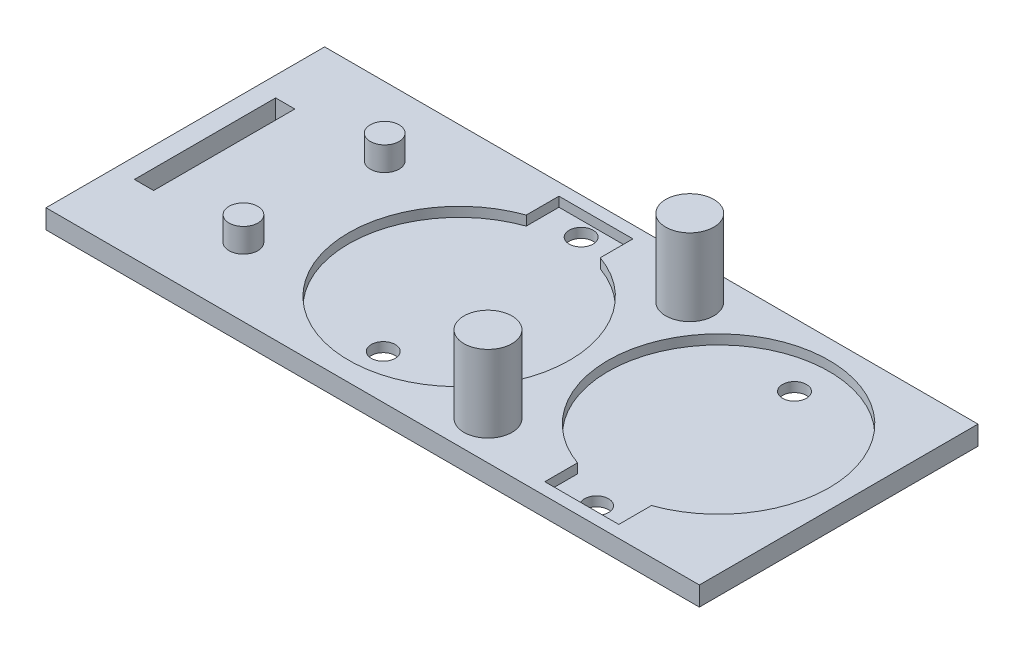
ISO-10303-21;
HEADER;
FILE_DESCRIPTION(('STEP AP214'),'2;1');
FILE_NAME('part.step','',(''),(''),'','','');
FILE_SCHEMA(('AUTOMOTIVE_DESIGN { 1 0 10303 214 1 1 1 1 }'));
ENDSEC;
DATA;
#1=APPLICATION_CONTEXT('core data for automotive mechanical design processes');
#2=APPLICATION_PROTOCOL_DEFINITION('international standard','automotive_design',2000,#1);
#3=PRODUCT_CONTEXT('',#1,'mechanical');
#4=PRODUCT('Part','Part','',(#3));
#5=PRODUCT_RELATED_PRODUCT_CATEGORY('part','',(#4));
#6=PRODUCT_DEFINITION_FORMATION('','',#4);
#7=PRODUCT_DEFINITION_CONTEXT('part definition',#1,'design');
#8=PRODUCT_DEFINITION('design','',#6,#7);
#9=PRODUCT_DEFINITION_SHAPE('','',#8);
#10=(LENGTH_UNIT() NAMED_UNIT(*) SI_UNIT(.MILLI.,.METRE.));
#11=(NAMED_UNIT(*) PLANE_ANGLE_UNIT() SI_UNIT($,.RADIAN.));
#12=(NAMED_UNIT(*) SI_UNIT($,.STERADIAN.) SOLID_ANGLE_UNIT());
#13=UNCERTAINTY_MEASURE_WITH_UNIT(LENGTH_MEASURE(1.E-05),#10,'distance_accuracy_value','');
#14=(GEOMETRIC_REPRESENTATION_CONTEXT(3) GLOBAL_UNCERTAINTY_ASSIGNED_CONTEXT((#13)) GLOBAL_UNIT_ASSIGNED_CONTEXT((#10,
#11,#12)) REPRESENTATION_CONTEXT('',''));
#15=CARTESIAN_POINT('',(0.,0.,0.));
#16=DIRECTION('',(0.,0.,1.));
#17=DIRECTION('',(1.,0.,0.));
#18=AXIS2_PLACEMENT_3D('',#15,#16,#17);
#19=CARTESIAN_POINT('',(-27.5555555555556,2.,-17.0555555555556));
#20=DIRECTION('',(1.,0.,0.));
#21=DIRECTION('',(0.,0.,-1.));
#22=AXIS2_PLACEMENT_3D('',#19,#20,#21);
#23=PLANE('',#22);
#24=DIRECTION('',(0.,0.,1.));
#25=VECTOR('',#24,1.);
#26=CARTESIAN_POINT('',(-27.5555555555556,0.,-17.0555555555556));
#27=LINE('',#26,#25);
#28=CARTESIAN_POINT('',(-27.5555555555556,0.,-17.0555555555556));
#29=VERTEX_POINT('',#28);
#30=CARTESIAN_POINT('',(-27.5555555555555,0.,11.9444444444444));
#31=VERTEX_POINT('',#30);
#32=EDGE_CURVE('E244',#29,#31,#27,.T.);
#33=ORIENTED_EDGE('',*,*,#32,.T.);
#34=DIRECTION('',(0.,-1.,0.));
#35=VECTOR('',#34,1.);
#36=CARTESIAN_POINT('',(-27.5555555555555,2.,11.9444444444444));
#37=LINE('',#36,#35);
#38=CARTESIAN_POINT('',(-27.5555555555555,2.,11.9444444444444));
#39=VERTEX_POINT('',#38);
#40=EDGE_CURVE('E273',#39,#31,#37,.T.);
#41=ORIENTED_EDGE('',*,*,#40,.F.);
#42=DIRECTION('',(0.,0.,1.));
#43=VECTOR('',#42,1.);
#44=CARTESIAN_POINT('',(-27.5555555555556,2.,-17.0555555555556));
#45=LINE('',#44,#43);
#46=CARTESIAN_POINT('',(-27.5555555555556,2.,-17.0555555555556));
#47=VERTEX_POINT('',#46);
#48=EDGE_CURVE('E247',#47,#39,#45,.T.);
#49=ORIENTED_EDGE('',*,*,#48,.F.);
#50=DIRECTION('',(0.,-1.,0.));
#51=VECTOR('',#50,1.);
#52=CARTESIAN_POINT('',(-27.5555555555556,2.,-17.0555555555556));
#53=LINE('',#52,#51);
#54=EDGE_CURVE('E257',#47,#29,#53,.T.);
#55=ORIENTED_EDGE('',*,*,#54,.T.);
#56=EDGE_LOOP('',(#33,#41,#49,#55));
#57=FACE_BOUND('',#56,.T.);
#58=ADVANCED_FACE('F33',(#57),#23,.F.);
#59=CARTESIAN_POINT('',(-27.5555555555555,2.,11.9444444444444));
#60=DIRECTION('',(0.,0.,-1.));
#61=DIRECTION('',(-1.,0.,0.));
#62=AXIS2_PLACEMENT_3D('',#59,#60,#61);
#63=PLANE('',#62);
#64=DIRECTION('',(1.,0.,0.));
#65=VECTOR('',#64,1.);
#66=CARTESIAN_POINT('',(-27.5555555555555,0.,11.9444444444444));
#67=LINE('',#66,#65);
#68=CARTESIAN_POINT('',(40.4444444444444,0.,11.9444444444444));
#69=VERTEX_POINT('',#68);
#70=EDGE_CURVE('E260',#31,#69,#67,.T.);
#71=ORIENTED_EDGE('',*,*,#70,.T.);
#72=DIRECTION('',(0.,-1.,0.));
#73=VECTOR('',#72,1.);
#74=CARTESIAN_POINT('',(40.4444444444444,2.,11.9444444444444));
#75=LINE('',#74,#73);
#76=CARTESIAN_POINT('',(40.4444444444444,2.,11.9444444444444));
#77=VERTEX_POINT('',#76);
#78=EDGE_CURVE('E270',#77,#69,#75,.T.);
#79=ORIENTED_EDGE('',*,*,#78,.F.);
#80=DIRECTION('',(1.,0.,0.));
#81=VECTOR('',#80,1.);
#82=CARTESIAN_POINT('',(-27.5555555555555,2.,11.9444444444444));
#83=LINE('',#82,#81);
#84=EDGE_CURVE('E250',#39,#77,#83,.T.);
#85=ORIENTED_EDGE('',*,*,#84,.F.);
#86=ORIENTED_EDGE('',*,*,#40,.T.);
#87=EDGE_LOOP('',(#71,#79,#85,#86));
#88=FACE_BOUND('',#87,.T.);
#89=ADVANCED_FACE('F316',(#88),#63,.F.);
#90=CARTESIAN_POINT('',(40.4444444444445,2.,-17.0555555555556));
#91=DIRECTION('',(-1.,0.,0.));
#92=DIRECTION('',(0.,0.,1.));
#93=AXIS2_PLACEMENT_3D('',#90,#91,#92);
#94=PLANE('',#93);
#95=DIRECTION('',(0.,0.,-1.));
#96=VECTOR('',#95,1.);
#97=CARTESIAN_POINT('',(40.4444444444445,0.,-17.0555555555556));
#98=LINE('',#97,#96);
#99=CARTESIAN_POINT('',(40.4444444444445,0.,-17.0555555555556));
#100=VERTEX_POINT('',#99);
#101=EDGE_CURVE('E262',#69,#100,#98,.T.);
#102=ORIENTED_EDGE('',*,*,#101,.T.);
#103=DIRECTION('',(0.,-1.,0.));
#104=VECTOR('',#103,1.);
#105=CARTESIAN_POINT('',(40.4444444444445,2.,-17.0555555555556));
#106=LINE('',#105,#104);
#107=CARTESIAN_POINT('',(40.4444444444445,2.,-17.0555555555556));
#108=VERTEX_POINT('',#107);
#109=EDGE_CURVE('E267',#108,#100,#106,.T.);
#110=ORIENTED_EDGE('',*,*,#109,.F.);
#111=DIRECTION('',(0.,0.,-1.));
#112=VECTOR('',#111,1.);
#113=CARTESIAN_POINT('',(40.4444444444445,2.,-17.0555555555556));
#114=LINE('',#113,#112);
#115=EDGE_CURVE('E253',#77,#108,#114,.T.);
#116=ORIENTED_EDGE('',*,*,#115,.F.);
#117=ORIENTED_EDGE('',*,*,#78,.T.);
#118=EDGE_LOOP('',(#102,#110,#116,#117));
#119=FACE_BOUND('',#118,.T.);
#120=ADVANCED_FACE('F321',(#119),#94,.F.);
#121=CARTESIAN_POINT('',(-27.5555555555556,2.,-17.0555555555556));
#122=DIRECTION('',(0.,0.,1.));
#123=DIRECTION('',(1.,0.,0.));
#124=AXIS2_PLACEMENT_3D('',#121,#122,#123);
#125=PLANE('',#124);
#126=DIRECTION('',(-1.,0.,0.));
#127=VECTOR('',#126,1.);
#128=CARTESIAN_POINT('',(-27.5555555555556,0.,-17.0555555555556));
#129=LINE('',#128,#127);
#130=EDGE_CURVE('E251',#100,#29,#129,.T.);
#131=ORIENTED_EDGE('',*,*,#130,.T.);
#132=ORIENTED_EDGE('',*,*,#54,.F.);
#133=DIRECTION('',(-1.,0.,0.));
#134=VECTOR('',#133,1.);
#135=CARTESIAN_POINT('',(-27.5555555555556,2.,-17.0555555555556));
#136=LINE('',#135,#134);
#137=EDGE_CURVE('E255',#108,#47,#136,.T.);
#138=ORIENTED_EDGE('',*,*,#137,.F.);
#139=ORIENTED_EDGE('',*,*,#109,.T.);
#140=EDGE_LOOP('',(#131,#132,#138,#139));
#141=FACE_BOUND('',#140,.T.);
#142=ADVANCED_FACE('F335',(#141),#125,.F.);
#143=CARTESIAN_POINT('',(0.,2.,0.));
#144=DIRECTION('',(0.,1.,0.));
#145=DIRECTION('',(0.,0.,1.));
#146=AXIS2_PLACEMENT_3D('',#143,#144,#145);
#147=PLANE('',#146);
#148=CARTESIAN_POINT('',(14.4444444444445,2.,7.94444444444445));
#149=DIRECTION('',(0.,1.,0.));
#150=DIRECTION('',(0.,0.,1.));
#151=AXIS2_PLACEMENT_3D('',#148,#149,#150);
#152=CIRCLE('',#151,2.5);
#153=CARTESIAN_POINT('',(14.4444444444445,2.,10.4444444444444));
#154=VERTEX_POINT('',#153);
#155=EDGE_CURVE('E440',#154,#154,#152,.T.);
#156=ORIENTED_EDGE('',*,*,#155,.F.);
#157=EDGE_LOOP('',(#156));
#158=FACE_BOUND('',#157,.T.);
#159=CARTESIAN_POINT('',(14.4444444444445,2.,-13.0555555555556));
#160=DIRECTION('',(0.,1.,0.));
#161=DIRECTION('',(0.,0.,1.));
#162=AXIS2_PLACEMENT_3D('',#159,#160,#161);
#163=CIRCLE('',#162,2.5);
#164=CARTESIAN_POINT('',(14.4444444444445,2.,-10.5555555555556));
#165=VERTEX_POINT('',#164);
#166=EDGE_CURVE('E439',#165,#165,#163,.T.);
#167=ORIENTED_EDGE('',*,*,#166,.F.);
#168=EDGE_LOOP('',(#167));
#169=FACE_BOUND('',#168,.T.);
#170=CARTESIAN_POINT('',(1.94444444444445,2.,-1.55555555555555));
#171=DIRECTION('',(0.,1.,0.));
#172=DIRECTION('',(0.,0.,1.));
#173=AXIS2_PLACEMENT_3D('',#170,#171,#172);
#174=CIRCLE('',#173,11.5);
#175=CARTESIAN_POINT('',(-1.90555555555555,2.,-12.3919525582498));
#176=VERTEX_POINT('',#175);
#177=CARTESIAN_POINT('',(5.79444444444445,2.,-12.3919525582498));
#178=VERTEX_POINT('',#177);
#179=EDGE_CURVE('E47',#176,#178,#174,.T.);
#180=ORIENTED_EDGE('',*,*,#179,.F.);
#181=DIRECTION('',(0.,0.,-1.));
#182=VECTOR('',#181,1.);
#183=CARTESIAN_POINT('',(-1.90555555555555,2.,0.));
#184=LINE('',#183,#182);
#185=CARTESIAN_POINT('',(-1.90555555555555,2.,-15.7919525582498));
#186=VERTEX_POINT('',#185);
#187=EDGE_CURVE('E164',#176,#186,#184,.T.);
#188=ORIENTED_EDGE('',*,*,#187,.T.);
#189=DIRECTION('',(1.,0.,0.));
#190=VECTOR('',#189,1.);
#191=CARTESIAN_POINT('',(0.,2.,-15.7919525582498));
#192=LINE('',#191,#190);
#193=CARTESIAN_POINT('',(5.79444444444445,2.,-15.7919525582498));
#194=VERTEX_POINT('',#193);
#195=EDGE_CURVE('E167',#186,#194,#192,.T.);
#196=ORIENTED_EDGE('',*,*,#195,.T.);
#197=DIRECTION('',(0.,0.,-1.));
#198=VECTOR('',#197,1.);
#199=CARTESIAN_POINT('',(5.79444444444445,2.,0.));
#200=LINE('',#199,#198);
#201=EDGE_CURVE('E176',#178,#194,#200,.T.);
#202=ORIENTED_EDGE('',*,*,#201,.F.);
#203=EDGE_LOOP('',(#180,#188,#196,#202));
#204=FACE_BOUND('',#203,.T.);
#205=CARTESIAN_POINT('',(26.9444444444444,2.,-3.55555555555555));
#206=DIRECTION('',(0.,1.,0.));
#207=DIRECTION('',(0.,0.,1.));
#208=AXIS2_PLACEMENT_3D('',#205,#206,#207);
#209=CIRCLE('',#208,11.5);
#210=CARTESIAN_POINT('',(30.7944444444445,2.,7.28084144713865));
#211=VERTEX_POINT('',#210);
#212=CARTESIAN_POINT('',(23.0944444444445,2.,7.28084144713865));
#213=VERTEX_POINT('',#212);
#214=EDGE_CURVE('E55',#211,#213,#209,.T.);
#215=ORIENTED_EDGE('',*,*,#214,.F.);
#216=DIRECTION('',(0.,0.,1.));
#217=VECTOR('',#216,1.);
#218=CARTESIAN_POINT('',(30.7944444444445,2.,0.));
#219=LINE('',#218,#217);
#220=CARTESIAN_POINT('',(30.7944444444445,2.,10.6808414471387));
#221=VERTEX_POINT('',#220);
#222=EDGE_CURVE('E189',#211,#221,#219,.T.);
#223=ORIENTED_EDGE('',*,*,#222,.T.);
#224=DIRECTION('',(1.,0.,0.));
#225=VECTOR('',#224,1.);
#226=CARTESIAN_POINT('',(0.,2.,10.6808414471387));
#227=LINE('',#226,#225);
#228=CARTESIAN_POINT('',(23.0944444444445,2.,10.6808414471387));
#229=VERTEX_POINT('',#228);
#230=EDGE_CURVE('E202',#229,#221,#227,.T.);
#231=ORIENTED_EDGE('',*,*,#230,.F.);
#232=DIRECTION('',(0.,0.,1.));
#233=VECTOR('',#232,1.);
#234=CARTESIAN_POINT('',(23.0944444444445,2.,0.));
#235=LINE('',#234,#233);
#236=EDGE_CURVE('E199',#213,#229,#235,.T.);
#237=ORIENTED_EDGE('',*,*,#236,.F.);
#238=EDGE_LOOP('',(#215,#223,#231,#237));
#239=FACE_BOUND('',#238,.T.);
#240=DIRECTION('',(0.,0.,1.));
#241=VECTOR('',#240,1.);
#242=CARTESIAN_POINT('',(-25.5055555555555,2.,-9.90555555555555));
#243=LINE('',#242,#241);
#244=CARTESIAN_POINT('',(-25.5055555555555,2.,-9.90555555555555));
#245=VERTEX_POINT('',#244);
#246=CARTESIAN_POINT('',(-25.5055555555555,2.,4.79444444444445));
#247=VERTEX_POINT('',#246);
#248=EDGE_CURVE('E209',#245,#247,#243,.T.);
#249=ORIENTED_EDGE('',*,*,#248,.F.);
#250=DIRECTION('',(-1.,0.,0.));
#251=VECTOR('',#250,1.);
#252=CARTESIAN_POINT('',(-25.5055555555555,2.,-9.90555555555555));
#253=LINE('',#252,#251);
#254=CARTESIAN_POINT('',(-23.5055555555555,2.,-9.90555555555555));
#255=VERTEX_POINT('',#254);
#256=EDGE_CURVE('E222',#255,#245,#253,.T.);
#257=ORIENTED_EDGE('',*,*,#256,.F.);
#258=DIRECTION('',(0.,0.,-1.));
#259=VECTOR('',#258,1.);
#260=CARTESIAN_POINT('',(-23.5055555555555,2.,-9.90555555555555));
#261=LINE('',#260,#259);
#262=CARTESIAN_POINT('',(-23.5055555555555,2.,4.79444444444445));
#263=VERTEX_POINT('',#262);
#264=EDGE_CURVE('E219',#263,#255,#261,.T.);
#265=ORIENTED_EDGE('',*,*,#264,.F.);
#266=DIRECTION('',(1.,0.,0.));
#267=VECTOR('',#266,1.);
#268=CARTESIAN_POINT('',(-25.5055555555555,2.,4.79444444444445));
#269=LINE('',#268,#267);
#270=EDGE_CURVE('E216',#247,#263,#269,.T.);
#271=ORIENTED_EDGE('',*,*,#270,.F.);
#272=EDGE_LOOP('',(#249,#257,#265,#271));
#273=FACE_BOUND('',#272,.T.);
#274=CARTESIAN_POINT('',(-14.1555555555555,2.,-9.90555555555555));
#275=DIRECTION('',(0.,1.,0.));
#276=DIRECTION('',(0.,0.,1.));
#277=AXIS2_PLACEMENT_3D('',#274,#275,#276);
#278=CIRCLE('',#277,1.5);
#279=CARTESIAN_POINT('',(-14.1555555555555,2.,-8.40555555555555));
#280=VERTEX_POINT('',#279);
#281=EDGE_CURVE('E228',#280,#280,#278,.T.);
#282=ORIENTED_EDGE('',*,*,#281,.F.);
#283=EDGE_LOOP('',(#282));
#284=FACE_BOUND('',#283,.T.);
#285=CARTESIAN_POINT('',(-14.1555555555555,2.,4.79444444444445));
#286=DIRECTION('',(0.,1.,0.));
#287=DIRECTION('',(0.,0.,1.));
#288=AXIS2_PLACEMENT_3D('',#285,#286,#287);
#289=CIRCLE('',#288,1.5);
#290=CARTESIAN_POINT('',(-14.1555555555555,2.,6.29444444444445));
#291=VERTEX_POINT('',#290);
#292=EDGE_CURVE('E238',#291,#291,#289,.T.);
#293=ORIENTED_EDGE('',*,*,#292,.F.);
#294=EDGE_LOOP('',(#293));
#295=FACE_BOUND('',#294,.T.);
#296=ORIENTED_EDGE('',*,*,#48,.T.);
#297=ORIENTED_EDGE('',*,*,#84,.T.);
#298=ORIENTED_EDGE('',*,*,#115,.T.);
#299=ORIENTED_EDGE('',*,*,#137,.T.);
#300=EDGE_LOOP('',(#296,#297,#298,#299));
#301=FACE_BOUND('',#300,.T.);
#302=ADVANCED_FACE('F297',(#158,#169,#204,#239,#273,#284,#295,#301),#147,.T.);
#303=CARTESIAN_POINT('',(0.,0.,0.));
#304=DIRECTION('',(0.,1.,0.));
#305=DIRECTION('',(0.,0.,1.));
#306=AXIS2_PLACEMENT_3D('',#303,#304,#305);
#307=PLANE('',#306);
#308=CARTESIAN_POINT('',(26.9444444444444,0.,-11.4555555555556));
#309=DIRECTION('',(0.,1.,0.));
#310=DIRECTION('',(0.,0.,1.));
#311=AXIS2_PLACEMENT_3D('',#308,#309,#310);
#312=CIRCLE('',#311,1.25);
#313=CARTESIAN_POINT('',(26.9444444444444,0.,-10.2055555555556));
#314=VERTEX_POINT('',#313);
#315=EDGE_CURVE('E459',#314,#314,#312,.T.);
#316=ORIENTED_EDGE('',*,*,#315,.T.);
#317=EDGE_LOOP('',(#316));
#318=FACE_BOUND('',#317,.T.);
#319=CARTESIAN_POINT('',(26.9444444444444,0.,9.14444444444445));
#320=DIRECTION('',(0.,1.,0.));
#321=DIRECTION('',(0.,0.,1.));
#322=AXIS2_PLACEMENT_3D('',#319,#320,#321);
#323=CIRCLE('',#322,1.25);
#324=CARTESIAN_POINT('',(26.9444444444444,0.,10.3944444444444));
#325=VERTEX_POINT('',#324);
#326=EDGE_CURVE('E454',#325,#325,#323,.T.);
#327=ORIENTED_EDGE('',*,*,#326,.T.);
#328=EDGE_LOOP('',(#327));
#329=FACE_BOUND('',#328,.T.);
#330=CARTESIAN_POINT('',(1.94444444444445,0.,-14.2555555555556));
#331=DIRECTION('',(0.,1.,0.));
#332=DIRECTION('',(0.,0.,1.));
#333=AXIS2_PLACEMENT_3D('',#330,#331,#332);
#334=CIRCLE('',#333,1.25);
#335=CARTESIAN_POINT('',(1.94444444444445,0.,-13.0055555555556));
#336=VERTEX_POINT('',#335);
#337=EDGE_CURVE('E170',#336,#336,#334,.T.);
#338=ORIENTED_EDGE('',*,*,#337,.T.);
#339=EDGE_LOOP('',(#338));
#340=FACE_BOUND('',#339,.T.);
#341=CARTESIAN_POINT('',(1.94444444444445,0.,6.34444444444445));
#342=DIRECTION('',(0.,1.,0.));
#343=DIRECTION('',(0.,0.,1.));
#344=AXIS2_PLACEMENT_3D('',#341,#342,#343);
#345=CIRCLE('',#344,1.25);
#346=CARTESIAN_POINT('',(1.94444444444445,0.,7.59444444444445));
#347=VERTEX_POINT('',#346);
#348=EDGE_CURVE('E466',#347,#347,#345,.T.);
#349=ORIENTED_EDGE('',*,*,#348,.T.);
#350=EDGE_LOOP('',(#349));
#351=FACE_BOUND('',#350,.T.);
#352=DIRECTION('',(-1.,0.,0.));
#353=VECTOR('',#352,1.);
#354=CARTESIAN_POINT('',(0.,0.,-9.90555555555555));
#355=LINE('',#354,#353);
#356=CARTESIAN_POINT('',(-23.5055555555555,0.,-9.90555555555555));
#357=VERTEX_POINT('',#356);
#358=CARTESIAN_POINT('',(-25.5055555555555,0.,-9.90555555555555));
#359=VERTEX_POINT('',#358);
#360=EDGE_CURVE('E40',#357,#359,#355,.T.);
#361=ORIENTED_EDGE('',*,*,#360,.T.);
#362=DIRECTION('',(0.,0.,1.));
#363=VECTOR('',#362,1.);
#364=CARTESIAN_POINT('',(-25.5055555555555,0.,0.));
#365=LINE('',#364,#363);
#366=CARTESIAN_POINT('',(-25.5055555555555,0.,4.79444444444445));
#367=VERTEX_POINT('',#366);
#368=EDGE_CURVE('E11',#359,#367,#365,.T.);
#369=ORIENTED_EDGE('',*,*,#368,.T.);
#370=DIRECTION('',(1.,0.,0.));
#371=VECTOR('',#370,1.);
#372=CARTESIAN_POINT('',(0.,0.,4.79444444444445));
#373=LINE('',#372,#371);
#374=CARTESIAN_POINT('',(-23.5055555555555,0.,4.79444444444445));
#375=VERTEX_POINT('',#374);
#376=EDGE_CURVE('E276',#367,#375,#373,.T.);
#377=ORIENTED_EDGE('',*,*,#376,.T.);
#378=DIRECTION('',(0.,0.,-1.));
#379=VECTOR('',#378,1.);
#380=CARTESIAN_POINT('',(-23.5055555555555,0.,0.));
#381=LINE('',#380,#379);
#382=EDGE_CURVE('E279',#375,#357,#381,.T.);
#383=ORIENTED_EDGE('',*,*,#382,.T.);
#384=EDGE_LOOP('',(#361,#369,#377,#383));
#385=FACE_BOUND('',#384,.T.);
#386=ORIENTED_EDGE('',*,*,#32,.F.);
#387=ORIENTED_EDGE('',*,*,#130,.F.);
#388=ORIENTED_EDGE('',*,*,#101,.F.);
#389=ORIENTED_EDGE('',*,*,#70,.F.);
#390=EDGE_LOOP('',(#386,#387,#388,#389));
#391=FACE_BOUND('',#390,.T.);
#392=ADVANCED_FACE('F283',(#318,#329,#340,#351,#385,#391),#307,.F.);
#393=CARTESIAN_POINT('',(-14.1555555555555,4.5,4.79444444444445));
#394=DIRECTION('',(0.,-1.,0.));
#395=DIRECTION('',(0.,0.,-1.));
#396=AXIS2_PLACEMENT_3D('',#393,#394,#395);
#397=CYLINDRICAL_SURFACE('',#396,1.5);
#398=CARTESIAN_POINT('',(-14.1555555555555,4.5,4.79444444444445));
#399=DIRECTION('',(0.,1.,0.));
#400=DIRECTION('',(0.,0.,1.));
#401=AXIS2_PLACEMENT_3D('',#398,#399,#400);
#402=CIRCLE('',#401,1.5);
#403=CARTESIAN_POINT('',(-14.1555555555555,4.5,6.29444444444445));
#404=VERTEX_POINT('',#403);
#405=EDGE_CURVE('E241',#404,#404,#402,.T.);
#406=ORIENTED_EDGE('',*,*,#405,.F.);
#407=EDGE_LOOP('',(#406));
#408=FACE_BOUND('',#407,.T.);
#409=ORIENTED_EDGE('',*,*,#292,.T.);
#410=EDGE_LOOP('',(#409));
#411=FACE_BOUND('',#410,.T.);
#412=ADVANCED_FACE('F346',(#408,#411),#397,.T.);
#413=CARTESIAN_POINT('',(-14.1555555555555,4.5,4.79444444444445));
#414=DIRECTION('',(0.,1.,0.));
#415=DIRECTION('',(0.,0.,1.));
#416=AXIS2_PLACEMENT_3D('',#413,#414,#415);
#417=PLANE('',#416);
#418=ORIENTED_EDGE('',*,*,#405,.T.);
#419=EDGE_LOOP('',(#418));
#420=FACE_BOUND('',#419,.T.);
#421=ADVANCED_FACE('F353',(#420),#417,.T.);
#422=CARTESIAN_POINT('',(-14.1555555555555,4.5,-9.90555555555555));
#423=DIRECTION('',(0.,-1.,0.));
#424=DIRECTION('',(0.,0.,-1.));
#425=AXIS2_PLACEMENT_3D('',#422,#423,#424);
#426=CYLINDRICAL_SURFACE('',#425,1.5);
#427=CARTESIAN_POINT('',(-14.1555555555555,4.5,-9.90555555555555));
#428=DIRECTION('',(0.,1.,0.));
#429=DIRECTION('',(0.,0.,1.));
#430=AXIS2_PLACEMENT_3D('',#427,#428,#429);
#431=CIRCLE('',#430,1.5);
#432=CARTESIAN_POINT('',(-14.1555555555555,4.5,-8.40555555555555));
#433=VERTEX_POINT('',#432);
#434=EDGE_CURVE('E235',#433,#433,#431,.T.);
#435=ORIENTED_EDGE('',*,*,#434,.F.);
#436=EDGE_LOOP('',(#435));
#437=FACE_BOUND('',#436,.T.);
#438=ORIENTED_EDGE('',*,*,#281,.T.);
#439=EDGE_LOOP('',(#438));
#440=FACE_BOUND('',#439,.T.);
#441=ADVANCED_FACE('F357',(#437,#440),#426,.T.);
#442=CARTESIAN_POINT('',(-14.1555555555555,4.5,-9.90555555555555));
#443=DIRECTION('',(0.,1.,0.));
#444=DIRECTION('',(0.,0.,1.));
#445=AXIS2_PLACEMENT_3D('',#442,#443,#444);
#446=PLANE('',#445);
#447=ORIENTED_EDGE('',*,*,#434,.T.);
#448=EDGE_LOOP('',(#447));
#449=FACE_BOUND('',#448,.T.);
#450=ADVANCED_FACE('F361',(#449),#446,.T.);
#451=CARTESIAN_POINT('',(-25.5055555555555,-0.5,-9.90555555555555));
#452=DIRECTION('',(-1.,0.,0.));
#453=DIRECTION('',(0.,0.,1.));
#454=AXIS2_PLACEMENT_3D('',#451,#452,#453);
#455=PLANE('',#454);
#456=DIRECTION('',(0.,1.,0.));
#457=VECTOR('',#456,1.);
#458=CARTESIAN_POINT('',(-25.5055555555555,-0.5,-9.90555555555555));
#459=LINE('',#458,#457);
#460=EDGE_CURVE('E226',#359,#245,#459,.T.);
#461=ORIENTED_EDGE('',*,*,#460,.T.);
#462=ORIENTED_EDGE('',*,*,#248,.T.);
#463=DIRECTION('',(0.,1.,0.));
#464=VECTOR('',#463,1.);
#465=CARTESIAN_POINT('',(-25.5055555555555,-0.5,4.79444444444445));
#466=LINE('',#465,#464);
#467=EDGE_CURVE('E225',#367,#247,#466,.T.);
#468=ORIENTED_EDGE('',*,*,#467,.F.);
#469=ORIENTED_EDGE('',*,*,#368,.F.);
#470=EDGE_LOOP('',(#461,#462,#468,#469));
#471=FACE_BOUND('',#470,.T.);
#472=ADVANCED_FACE('F301',(#471),#455,.F.);
#473=CARTESIAN_POINT('',(-25.5055555555555,-0.5,-9.90555555555555));
#474=DIRECTION('',(0.,0.,-1.));
#475=DIRECTION('',(-1.,0.,0.));
#476=AXIS2_PLACEMENT_3D('',#473,#474,#475);
#477=PLANE('',#476);
#478=DIRECTION('',(0.,1.,0.));
#479=VECTOR('',#478,1.);
#480=CARTESIAN_POINT('',(-23.5055555555555,-0.5,-9.90555555555555));
#481=LINE('',#480,#479);
#482=EDGE_CURVE('E229',#357,#255,#481,.T.);
#483=ORIENTED_EDGE('',*,*,#482,.T.);
#484=ORIENTED_EDGE('',*,*,#256,.T.);
#485=ORIENTED_EDGE('',*,*,#460,.F.);
#486=ORIENTED_EDGE('',*,*,#360,.F.);
#487=EDGE_LOOP('',(#483,#484,#485,#486));
#488=FACE_BOUND('',#487,.T.);
#489=ADVANCED_FACE('F289',(#488),#477,.F.);
#490=CARTESIAN_POINT('',(-23.5055555555555,-0.5,-9.90555555555555));
#491=DIRECTION('',(1.,0.,0.));
#492=DIRECTION('',(0.,0.,-1.));
#493=AXIS2_PLACEMENT_3D('',#490,#491,#492);
#494=PLANE('',#493);
#495=DIRECTION('',(0.,1.,0.));
#496=VECTOR('',#495,1.);
#497=CARTESIAN_POINT('',(-23.5055555555555,-0.5,4.79444444444445));
#498=LINE('',#497,#496);
#499=EDGE_CURVE('E231',#375,#263,#498,.T.);
#500=ORIENTED_EDGE('',*,*,#499,.T.);
#501=ORIENTED_EDGE('',*,*,#264,.T.);
#502=ORIENTED_EDGE('',*,*,#482,.F.);
#503=ORIENTED_EDGE('',*,*,#382,.F.);
#504=EDGE_LOOP('',(#500,#501,#502,#503));
#505=FACE_BOUND('',#504,.T.);
#506=ADVANCED_FACE('F291',(#505),#494,.F.);
#507=CARTESIAN_POINT('',(-25.5055555555555,-0.5,4.79444444444445));
#508=DIRECTION('',(0.,0.,1.));
#509=DIRECTION('',(1.,0.,0.));
#510=AXIS2_PLACEMENT_3D('',#507,#508,#509);
#511=PLANE('',#510);
#512=ORIENTED_EDGE('',*,*,#467,.T.);
#513=ORIENTED_EDGE('',*,*,#270,.T.);
#514=ORIENTED_EDGE('',*,*,#499,.F.);
#515=ORIENTED_EDGE('',*,*,#376,.F.);
#516=EDGE_LOOP('',(#512,#513,#514,#515));
#517=FACE_BOUND('',#516,.T.);
#518=ADVANCED_FACE('F303',(#517),#511,.F.);
#519=CARTESIAN_POINT('',(26.9444444444444,1.,-3.55555555555555));
#520=DIRECTION('',(0.,1.,0.));
#521=DIRECTION('',(0.,0.,1.));
#522=AXIS2_PLACEMENT_3D('',#519,#520,#521);
#523=CYLINDRICAL_SURFACE('',#522,11.5);
#524=ORIENTED_EDGE('',*,*,#214,.T.);
#525=DIRECTION('',(0.,1.,0.));
#526=VECTOR('',#525,1.);
#527=CARTESIAN_POINT('',(23.0944444444445,1.,7.28084144713865));
#528=LINE('',#527,#526);
#529=CARTESIAN_POINT('',(23.0944444444445,1.,7.28084144713865));
#530=VERTEX_POINT('',#529);
#531=EDGE_CURVE('E197',#530,#213,#528,.T.);
#532=ORIENTED_EDGE('',*,*,#531,.F.);
#533=CARTESIAN_POINT('',(26.9444444444444,1.,-3.55555555555555));
#534=DIRECTION('',(0.,1.,0.));
#535=DIRECTION('',(0.,0.,1.));
#536=AXIS2_PLACEMENT_3D('',#533,#534,#535);
#537=CIRCLE('',#536,11.5);
#538=CARTESIAN_POINT('',(30.7944444444445,1.,7.28084144713865));
#539=VERTEX_POINT('',#538);
#540=EDGE_CURVE('E185',#539,#530,#537,.T.);
#541=ORIENTED_EDGE('',*,*,#540,.F.);
#542=DIRECTION('',(0.,1.,0.));
#543=VECTOR('',#542,1.);
#544=CARTESIAN_POINT('',(30.7944444444445,1.,7.28084144713865));
#545=LINE('',#544,#543);
#546=EDGE_CURVE('E207',#539,#211,#545,.T.);
#547=ORIENTED_EDGE('',*,*,#546,.T.);
#548=EDGE_LOOP('',(#524,#532,#541,#547));
#549=FACE_BOUND('',#548,.T.);
#550=ADVANCED_FACE('F305',(#549),#523,.F.);
#551=CARTESIAN_POINT('',(30.7944444444445,1.,0.));
#552=DIRECTION('',(-1.,0.,0.));
#553=DIRECTION('',(0.,0.,1.));
#554=AXIS2_PLACEMENT_3D('',#551,#552,#553);
#555=PLANE('',#554);
#556=ORIENTED_EDGE('',*,*,#222,.F.);
#557=ORIENTED_EDGE('',*,*,#546,.F.);
#558=DIRECTION('',(0.,0.,1.));
#559=VECTOR('',#558,1.);
#560=CARTESIAN_POINT('',(30.7944444444445,1.,0.));
#561=LINE('',#560,#559);
#562=CARTESIAN_POINT('',(30.7944444444445,1.,10.6808414471387));
#563=VERTEX_POINT('',#562);
#564=EDGE_CURVE('E195',#539,#563,#561,.T.);
#565=ORIENTED_EDGE('',*,*,#564,.T.);
#566=DIRECTION('',(0.,1.,0.));
#567=VECTOR('',#566,1.);
#568=CARTESIAN_POINT('',(30.7944444444445,1.,10.6808414471387));
#569=LINE('',#568,#567);
#570=EDGE_CURVE('E210',#563,#221,#569,.T.);
#571=ORIENTED_EDGE('',*,*,#570,.T.);
#572=EDGE_LOOP('',(#556,#557,#565,#571));
#573=FACE_BOUND('',#572,.T.);
#574=ADVANCED_FACE('F311',(#573),#555,.T.);
#575=CARTESIAN_POINT('',(0.,1.,10.6808414471387));
#576=DIRECTION('',(0.,0.,1.));
#577=DIRECTION('',(1.,0.,0.));
#578=AXIS2_PLACEMENT_3D('',#575,#576,#577);
#579=PLANE('',#578);
#580=ORIENTED_EDGE('',*,*,#230,.T.);
#581=ORIENTED_EDGE('',*,*,#570,.F.);
#582=DIRECTION('',(1.,0.,0.));
#583=VECTOR('',#582,1.);
#584=CARTESIAN_POINT('',(0.,1.,10.6808414471387));
#585=LINE('',#584,#583);
#586=CARTESIAN_POINT('',(23.0944444444445,1.,10.6808414471387));
#587=VERTEX_POINT('',#586);
#588=EDGE_CURVE('E192',#587,#563,#585,.T.);
#589=ORIENTED_EDGE('',*,*,#588,.F.);
#590=DIRECTION('',(0.,1.,0.));
#591=VECTOR('',#590,1.);
#592=CARTESIAN_POINT('',(23.0944444444445,1.,10.6808414471387));
#593=LINE('',#592,#591);
#594=EDGE_CURVE('E212',#587,#229,#593,.T.);
#595=ORIENTED_EDGE('',*,*,#594,.T.);
#596=EDGE_LOOP('',(#580,#581,#589,#595));
#597=FACE_BOUND('',#596,.T.);
#598=ADVANCED_FACE('F377',(#597),#579,.F.);
#599=CARTESIAN_POINT('',(23.0944444444445,1.,0.));
#600=DIRECTION('',(-1.,0.,0.));
#601=DIRECTION('',(0.,0.,1.));
#602=AXIS2_PLACEMENT_3D('',#599,#600,#601);
#603=PLANE('',#602);
#604=ORIENTED_EDGE('',*,*,#236,.T.);
#605=ORIENTED_EDGE('',*,*,#594,.F.);
#606=DIRECTION('',(0.,0.,1.));
#607=VECTOR('',#606,1.);
#608=CARTESIAN_POINT('',(23.0944444444445,1.,0.));
#609=LINE('',#608,#607);
#610=EDGE_CURVE('E188',#530,#587,#609,.T.);
#611=ORIENTED_EDGE('',*,*,#610,.F.);
#612=ORIENTED_EDGE('',*,*,#531,.T.);
#613=EDGE_LOOP('',(#604,#605,#611,#612));
#614=FACE_BOUND('',#613,.T.);
#615=ADVANCED_FACE('F373',(#614),#603,.F.);
#616=CARTESIAN_POINT('',(0.,1.,0.));
#617=DIRECTION('',(0.,1.,0.));
#618=DIRECTION('',(0.,0.,1.));
#619=AXIS2_PLACEMENT_3D('',#616,#617,#618);
#620=PLANE('',#619);
#621=CARTESIAN_POINT('',(26.9444444444444,1.,-11.4555555555556));
#622=DIRECTION('',(0.,1.,0.));
#623=DIRECTION('',(0.,0.,1.));
#624=AXIS2_PLACEMENT_3D('',#621,#622,#623);
#625=CIRCLE('',#624,1.25);
#626=CARTESIAN_POINT('',(26.9444444444444,1.,-10.2055555555556));
#627=VERTEX_POINT('',#626);
#628=EDGE_CURVE('E451',#627,#627,#625,.T.);
#629=ORIENTED_EDGE('',*,*,#628,.F.);
#630=EDGE_LOOP('',(#629));
#631=FACE_BOUND('',#630,.T.);
#632=CARTESIAN_POINT('',(26.9444444444444,1.,9.14444444444445));
#633=DIRECTION('',(0.,1.,0.));
#634=DIRECTION('',(0.,0.,1.));
#635=AXIS2_PLACEMENT_3D('',#632,#633,#634);
#636=CIRCLE('',#635,1.25);
#637=CARTESIAN_POINT('',(26.9444444444444,1.,10.3944444444444));
#638=VERTEX_POINT('',#637);
#639=EDGE_CURVE('E449',#638,#638,#636,.T.);
#640=ORIENTED_EDGE('',*,*,#639,.F.);
#641=EDGE_LOOP('',(#640));
#642=FACE_BOUND('',#641,.T.);
#643=ORIENTED_EDGE('',*,*,#540,.T.);
#644=ORIENTED_EDGE('',*,*,#610,.T.);
#645=ORIENTED_EDGE('',*,*,#588,.T.);
#646=ORIENTED_EDGE('',*,*,#564,.F.);
#647=EDGE_LOOP('',(#643,#644,#645,#646));
#648=FACE_BOUND('',#647,.T.);
#649=ADVANCED_FACE('F376',(#631,#642,#648),#620,.T.);
#650=CARTESIAN_POINT('',(1.94444444444445,1.,-1.55555555555555));
#651=DIRECTION('',(0.,1.,0.));
#652=DIRECTION('',(0.,0.,1.));
#653=AXIS2_PLACEMENT_3D('',#650,#651,#652);
#654=CYLINDRICAL_SURFACE('',#653,11.5);
#655=ORIENTED_EDGE('',*,*,#179,.T.);
#656=DIRECTION('',(0.,1.,0.));
#657=VECTOR('',#656,1.);
#658=CARTESIAN_POINT('',(5.79444444444445,1.,-12.3919525582498));
#659=LINE('',#658,#657);
#660=CARTESIAN_POINT('',(5.79444444444445,1.,-12.3919525582498));
#661=VERTEX_POINT('',#660);
#662=EDGE_CURVE('E143',#661,#178,#659,.T.);
#663=ORIENTED_EDGE('',*,*,#662,.F.);
#664=CARTESIAN_POINT('',(1.94444444444445,1.,-1.55555555555555));
#665=DIRECTION('',(0.,1.,0.));
#666=DIRECTION('',(0.,0.,1.));
#667=AXIS2_PLACEMENT_3D('',#664,#665,#666);
#668=CIRCLE('',#667,11.5);
#669=CARTESIAN_POINT('',(-1.90555555555555,1.,-12.3919525582498));
#670=VERTEX_POINT('',#669);
#671=EDGE_CURVE('E147',#670,#661,#668,.T.);
#672=ORIENTED_EDGE('',*,*,#671,.F.);
#673=DIRECTION('',(0.,1.,0.));
#674=VECTOR('',#673,1.);
#675=CARTESIAN_POINT('',(-1.90555555555555,1.,-12.3919525582498));
#676=LINE('',#675,#674);
#677=EDGE_CURVE('E180',#670,#176,#676,.T.);
#678=ORIENTED_EDGE('',*,*,#677,.T.);
#679=EDGE_LOOP('',(#655,#663,#672,#678));
#680=FACE_BOUND('',#679,.T.);
#681=ADVANCED_FACE('F145',(#680),#654,.F.);
#682=CARTESIAN_POINT('',(-1.90555555555555,1.,0.));
#683=DIRECTION('',(1.,0.,0.));
#684=DIRECTION('',(0.,0.,-1.));
#685=AXIS2_PLACEMENT_3D('',#682,#683,#684);
#686=PLANE('',#685);
#687=ORIENTED_EDGE('',*,*,#187,.F.);
#688=ORIENTED_EDGE('',*,*,#677,.F.);
#689=DIRECTION('',(0.,0.,-1.));
#690=VECTOR('',#689,1.);
#691=CARTESIAN_POINT('',(-1.90555555555555,1.,0.));
#692=LINE('',#691,#690);
#693=CARTESIAN_POINT('',(-1.90555555555555,1.,-15.7919525582498));
#694=VERTEX_POINT('',#693);
#695=EDGE_CURVE('E152',#670,#694,#692,.T.);
#696=ORIENTED_EDGE('',*,*,#695,.T.);
#697=DIRECTION('',(0.,1.,0.));
#698=VECTOR('',#697,1.);
#699=CARTESIAN_POINT('',(-1.90555555555555,1.,-15.7919525582498));
#700=LINE('',#699,#698);
#701=EDGE_CURVE('E182',#694,#186,#700,.T.);
#702=ORIENTED_EDGE('',*,*,#701,.T.);
#703=EDGE_LOOP('',(#687,#688,#696,#702));
#704=FACE_BOUND('',#703,.T.);
#705=ADVANCED_FACE('F390',(#704),#686,.T.);
#706=CARTESIAN_POINT('',(0.,1.,-15.7919525582498));
#707=DIRECTION('',(0.,0.,1.));
#708=DIRECTION('',(1.,0.,0.));
#709=AXIS2_PLACEMENT_3D('',#706,#707,#708);
#710=PLANE('',#709);
#711=ORIENTED_EDGE('',*,*,#195,.F.);
#712=ORIENTED_EDGE('',*,*,#701,.F.);
#713=DIRECTION('',(1.,0.,0.));
#714=VECTOR('',#713,1.);
#715=CARTESIAN_POINT('',(0.,1.,-15.7919525582498));
#716=LINE('',#715,#714);
#717=CARTESIAN_POINT('',(5.79444444444445,1.,-15.7919525582498));
#718=VERTEX_POINT('',#717);
#719=EDGE_CURVE('E160',#694,#718,#716,.T.);
#720=ORIENTED_EDGE('',*,*,#719,.T.);
#721=DIRECTION('',(0.,1.,0.));
#722=VECTOR('',#721,1.);
#723=CARTESIAN_POINT('',(5.79444444444445,1.,-15.7919525582498));
#724=LINE('',#723,#722);
#725=EDGE_CURVE('E151',#718,#194,#724,.T.);
#726=ORIENTED_EDGE('',*,*,#725,.T.);
#727=EDGE_LOOP('',(#711,#712,#720,#726));
#728=FACE_BOUND('',#727,.T.);
#729=ADVANCED_FACE('F393',(#728),#710,.T.);
#730=CARTESIAN_POINT('',(5.79444444444445,1.,0.));
#731=DIRECTION('',(1.,0.,0.));
#732=DIRECTION('',(0.,0.,-1.));
#733=AXIS2_PLACEMENT_3D('',#730,#731,#732);
#734=PLANE('',#733);
#735=ORIENTED_EDGE('',*,*,#201,.T.);
#736=ORIENTED_EDGE('',*,*,#725,.F.);
#737=DIRECTION('',(0.,0.,-1.));
#738=VECTOR('',#737,1.);
#739=CARTESIAN_POINT('',(5.79444444444445,1.,0.));
#740=LINE('',#739,#738);
#741=EDGE_CURVE('E156',#661,#718,#740,.T.);
#742=ORIENTED_EDGE('',*,*,#741,.F.);
#743=ORIENTED_EDGE('',*,*,#662,.T.);
#744=EDGE_LOOP('',(#735,#736,#742,#743));
#745=FACE_BOUND('',#744,.T.);
#746=ADVANCED_FACE('F157',(#745),#734,.F.);
#747=CARTESIAN_POINT('',(0.,1.,0.));
#748=DIRECTION('',(0.,1.,0.));
#749=DIRECTION('',(0.,0.,1.));
#750=AXIS2_PLACEMENT_3D('',#747,#748,#749);
#751=PLANE('',#750);
#752=CARTESIAN_POINT('',(1.94444444444445,1.,-14.2555555555556));
#753=DIRECTION('',(0.,1.,0.));
#754=DIRECTION('',(0.,0.,1.));
#755=AXIS2_PLACEMENT_3D('',#752,#753,#754);
#756=CIRCLE('',#755,1.25);
#757=CARTESIAN_POINT('',(1.94444444444445,1.,-13.0055555555556));
#758=VERTEX_POINT('',#757);
#759=EDGE_CURVE('E463',#758,#758,#756,.T.);
#760=ORIENTED_EDGE('',*,*,#759,.F.);
#761=EDGE_LOOP('',(#760));
#762=FACE_BOUND('',#761,.T.);
#763=CARTESIAN_POINT('',(1.94444444444445,1.,6.34444444444445));
#764=DIRECTION('',(0.,1.,0.));
#765=DIRECTION('',(0.,0.,1.));
#766=AXIS2_PLACEMENT_3D('',#763,#764,#765);
#767=CIRCLE('',#766,1.25);
#768=CARTESIAN_POINT('',(1.94444444444445,1.,7.59444444444445));
#769=VERTEX_POINT('',#768);
#770=EDGE_CURVE('E462',#769,#769,#767,.T.);
#771=ORIENTED_EDGE('',*,*,#770,.F.);
#772=EDGE_LOOP('',(#771));
#773=FACE_BOUND('',#772,.T.);
#774=ORIENTED_EDGE('',*,*,#671,.T.);
#775=ORIENTED_EDGE('',*,*,#741,.T.);
#776=ORIENTED_EDGE('',*,*,#719,.F.);
#777=ORIENTED_EDGE('',*,*,#695,.F.);
#778=EDGE_LOOP('',(#774,#775,#776,#777));
#779=FACE_BOUND('',#778,.T.);
#780=ADVANCED_FACE('F163',(#762,#773,#779),#751,.T.);
#781=CARTESIAN_POINT('',(1.94444444444445,-0.5,6.34444444444445));
#782=DIRECTION('',(0.,1.,0.));
#783=DIRECTION('',(0.,0.,1.));
#784=AXIS2_PLACEMENT_3D('',#781,#782,#783);
#785=CYLINDRICAL_SURFACE('',#784,1.25);
#786=ORIENTED_EDGE('',*,*,#770,.T.);
#787=EDGE_LOOP('',(#786));
#788=FACE_BOUND('',#787,.T.);
#789=ORIENTED_EDGE('',*,*,#348,.F.);
#790=EDGE_LOOP('',(#789));
#791=FACE_BOUND('',#790,.T.);
#792=ADVANCED_FACE('F402',(#788,#791),#785,.F.);
#793=CARTESIAN_POINT('',(1.94444444444445,-0.5,-14.2555555555556));
#794=DIRECTION('',(0.,1.,0.));
#795=DIRECTION('',(0.,0.,1.));
#796=AXIS2_PLACEMENT_3D('',#793,#794,#795);
#797=CYLINDRICAL_SURFACE('',#796,1.25);
#798=ORIENTED_EDGE('',*,*,#759,.T.);
#799=EDGE_LOOP('',(#798));
#800=FACE_BOUND('',#799,.T.);
#801=ORIENTED_EDGE('',*,*,#337,.F.);
#802=EDGE_LOOP('',(#801));
#803=FACE_BOUND('',#802,.T.);
#804=ADVANCED_FACE('F406',(#800,#803),#797,.F.);
#805=CARTESIAN_POINT('',(26.9444444444444,-0.5,9.14444444444445));
#806=DIRECTION('',(0.,1.,0.));
#807=DIRECTION('',(0.,0.,1.));
#808=AXIS2_PLACEMENT_3D('',#805,#806,#807);
#809=CYLINDRICAL_SURFACE('',#808,1.25);
#810=ORIENTED_EDGE('',*,*,#639,.T.);
#811=EDGE_LOOP('',(#810));
#812=FACE_BOUND('',#811,.T.);
#813=ORIENTED_EDGE('',*,*,#326,.F.);
#814=EDGE_LOOP('',(#813));
#815=FACE_BOUND('',#814,.T.);
#816=ADVANCED_FACE('F410',(#812,#815),#809,.F.);
#817=CARTESIAN_POINT('',(26.9444444444444,-0.5,-11.4555555555556));
#818=DIRECTION('',(0.,1.,0.));
#819=DIRECTION('',(0.,0.,1.));
#820=AXIS2_PLACEMENT_3D('',#817,#818,#819);
#821=CYLINDRICAL_SURFACE('',#820,1.25);
#822=ORIENTED_EDGE('',*,*,#628,.T.);
#823=EDGE_LOOP('',(#822));
#824=FACE_BOUND('',#823,.T.);
#825=ORIENTED_EDGE('',*,*,#315,.F.);
#826=EDGE_LOOP('',(#825));
#827=FACE_BOUND('',#826,.T.);
#828=ADVANCED_FACE('F414',(#824,#827),#821,.F.);
#829=CARTESIAN_POINT('',(14.4444444444445,10.,-13.0555555555556));
#830=DIRECTION('',(0.,-1.,0.));
#831=DIRECTION('',(0.,0.,-1.));
#832=AXIS2_PLACEMENT_3D('',#829,#830,#831);
#833=CYLINDRICAL_SURFACE('',#832,2.5);
#834=CARTESIAN_POINT('',(14.4444444444445,10.,-13.0555555555556));
#835=DIRECTION('',(0.,1.,0.));
#836=DIRECTION('',(0.,0.,1.));
#837=AXIS2_PLACEMENT_3D('',#834,#835,#836);
#838=CIRCLE('',#837,2.5);
#839=CARTESIAN_POINT('',(14.4444444444445,10.,-10.5555555555556));
#840=VERTEX_POINT('',#839);
#841=EDGE_CURVE('E443',#840,#840,#838,.T.);
#842=ORIENTED_EDGE('',*,*,#841,.F.);
#843=EDGE_LOOP('',(#842));
#844=FACE_BOUND('',#843,.T.);
#845=ORIENTED_EDGE('',*,*,#166,.T.);
#846=EDGE_LOOP('',(#845));
#847=FACE_BOUND('',#846,.T.);
#848=ADVANCED_FACE('F418',(#844,#847),#833,.T.);
#849=CARTESIAN_POINT('',(14.4444444444445,10.,-13.0555555555556));
#850=DIRECTION('',(0.,1.,0.));
#851=DIRECTION('',(0.,0.,1.));
#852=AXIS2_PLACEMENT_3D('',#849,#850,#851);
#853=PLANE('',#852);
#854=ORIENTED_EDGE('',*,*,#841,.T.);
#855=EDGE_LOOP('',(#854));
#856=FACE_BOUND('',#855,.T.);
#857=ADVANCED_FACE('F422',(#856),#853,.T.);
#858=CARTESIAN_POINT('',(14.4444444444445,10.,7.94444444444445));
#859=DIRECTION('',(0.,-1.,0.));
#860=DIRECTION('',(0.,0.,-1.));
#861=AXIS2_PLACEMENT_3D('',#858,#859,#860);
#862=CYLINDRICAL_SURFACE('',#861,2.5);
#863=CARTESIAN_POINT('',(14.4444444444445,10.,7.94444444444445));
#864=DIRECTION('',(0.,1.,0.));
#865=DIRECTION('',(0.,0.,1.));
#866=AXIS2_PLACEMENT_3D('',#863,#864,#865);
#867=CIRCLE('',#866,2.5);
#868=CARTESIAN_POINT('',(14.4444444444445,10.,10.4444444444444));
#869=VERTEX_POINT('',#868);
#870=EDGE_CURVE('E438',#869,#869,#867,.T.);
#871=ORIENTED_EDGE('',*,*,#870,.F.);
#872=EDGE_LOOP('',(#871));
#873=FACE_BOUND('',#872,.T.);
#874=ORIENTED_EDGE('',*,*,#155,.T.);
#875=EDGE_LOOP('',(#874));
#876=FACE_BOUND('',#875,.T.);
#877=ADVANCED_FACE('F426',(#873,#876),#862,.T.);
#878=CARTESIAN_POINT('',(14.4444444444445,10.,7.94444444444445));
#879=DIRECTION('',(0.,1.,0.));
#880=DIRECTION('',(0.,0.,1.));
#881=AXIS2_PLACEMENT_3D('',#878,#879,#880);
#882=PLANE('',#881);
#883=ORIENTED_EDGE('',*,*,#870,.T.);
#884=EDGE_LOOP('',(#883));
#885=FACE_BOUND('',#884,.T.);
#886=ADVANCED_FACE('F430',(#885),#882,.T.);
#887=CLOSED_SHELL('',(#58,#89,#120,#142,#302,#392,#412,#421,#441,#450,#472,#489,#506,#518,#550,
#574,#598,#615,#649,#681,#705,#729,#746,#780,#792,#804,#816,#828,#848,#857,#877,#886));
#888=MANIFOLD_SOLID_BREP('B2',#887);
#889=ADVANCED_BREP_SHAPE_REPRESENTATION('',(#18,#888),#14);
#890=SHAPE_DEFINITION_REPRESENTATION(#9,#889);
ENDSEC;
END-ISO-10303-21;
